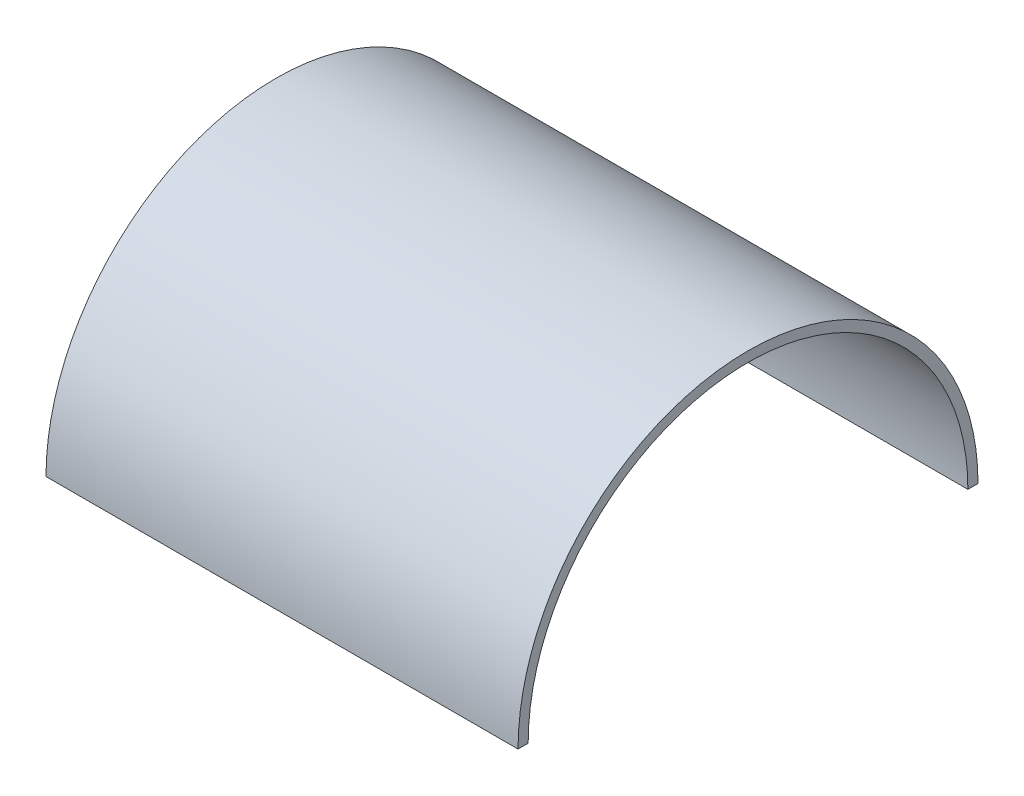
ISO-10303-21;
HEADER;
FILE_DESCRIPTION(('STEP AP214'),'2;1');
FILE_NAME('part.step','',(''),(''),'','','');
FILE_SCHEMA(('AUTOMOTIVE_DESIGN { 1 0 10303 214 1 1 1 1 }'));
ENDSEC;
DATA;
#1=APPLICATION_CONTEXT('core data for automotive mechanical design processes');
#2=APPLICATION_PROTOCOL_DEFINITION('international standard','automotive_design',2000,#1);
#3=PRODUCT_CONTEXT('',#1,'mechanical');
#4=PRODUCT('Part','Part','',(#3));
#5=PRODUCT_RELATED_PRODUCT_CATEGORY('part','',(#4));
#6=PRODUCT_DEFINITION_FORMATION('','',#4);
#7=PRODUCT_DEFINITION_CONTEXT('part definition',#1,'design');
#8=PRODUCT_DEFINITION('design','',#6,#7);
#9=PRODUCT_DEFINITION_SHAPE('','',#8);
#10=(LENGTH_UNIT() NAMED_UNIT(*) SI_UNIT(.MILLI.,.METRE.));
#11=(NAMED_UNIT(*) PLANE_ANGLE_UNIT() SI_UNIT($,.RADIAN.));
#12=(NAMED_UNIT(*) SI_UNIT($,.STERADIAN.) SOLID_ANGLE_UNIT());
#13=UNCERTAINTY_MEASURE_WITH_UNIT(LENGTH_MEASURE(1.E-05),#10,'distance_accuracy_value','');
#14=(GEOMETRIC_REPRESENTATION_CONTEXT(3) GLOBAL_UNCERTAINTY_ASSIGNED_CONTEXT((#13)) GLOBAL_UNIT_ASSIGNED_CONTEXT((#10,
#11,#12)) REPRESENTATION_CONTEXT('',''));
#15=CARTESIAN_POINT('',(0.,0.,0.));
#16=DIRECTION('',(0.,0.,1.));
#17=DIRECTION('',(1.,0.,0.));
#18=AXIS2_PLACEMENT_3D('',#15,#16,#17);
#19=CARTESIAN_POINT('',(-118.618,0.,-57.7898203895435));
#20=DIRECTION('',(1.,0.,0.));
#21=DIRECTION('',(0.,0.,-1.));
#22=AXIS2_PLACEMENT_3D('',#19,#20,#21);
#23=CYLINDRICAL_SURFACE('',#22,55.2498203895435);
#24=CARTESIAN_POINT('',(0.,0.,-57.7898203895435));
#25=DIRECTION('',(1.,0.,0.));
#26=DIRECTION('',(0.,0.,-1.));
#27=AXIS2_PLACEMENT_3D('',#24,#25,#26);
#28=CIRCLE('',#27,55.2498203895435);
#29=CARTESIAN_POINT('',(0.,0.,-2.54));
#30=VERTEX_POINT('',#29);
#31=CARTESIAN_POINT('',(0.,0.,-113.039640779087));
#32=VERTEX_POINT('',#31);
#33=EDGE_CURVE('E96',#30,#32,#28,.F.);
#34=ORIENTED_EDGE('',*,*,#33,.F.);
#35=DIRECTION('',(1.,0.,0.));
#36=VECTOR('',#35,1.);
#37=CARTESIAN_POINT('',(-118.618,0.,-2.54));
#38=LINE('',#37,#36);
#39=CARTESIAN_POINT('',(-118.618,0.,-2.54));
#40=VERTEX_POINT('',#39);
#41=EDGE_CURVE('E11',#40,#30,#38,.T.);
#42=ORIENTED_EDGE('',*,*,#41,.F.);
#43=CARTESIAN_POINT('',(-118.618,0.,-57.7898203895435));
#44=DIRECTION('',(1.,0.,0.));
#45=DIRECTION('',(0.,0.,-1.));
#46=AXIS2_PLACEMENT_3D('',#43,#44,#45);
#47=CIRCLE('',#46,55.2498203895435);
#48=CARTESIAN_POINT('',(-118.618,0.,-113.039640779087));
#49=VERTEX_POINT('',#48);
#50=EDGE_CURVE('E91',#40,#49,#47,.F.);
#51=ORIENTED_EDGE('',*,*,#50,.T.);
#52=DIRECTION('',(1.,0.,0.));
#53=VECTOR('',#52,1.);
#54=CARTESIAN_POINT('',(-118.618,0.,-113.039640779087));
#55=LINE('',#54,#53);
#56=EDGE_CURVE('E34',#49,#32,#55,.T.);
#57=ORIENTED_EDGE('',*,*,#56,.T.);
#58=EDGE_LOOP('',(#34,#42,#51,#57));
#59=FACE_BOUND('',#58,.T.);
#60=ADVANCED_FACE('F31',(#59),#23,.F.);
#61=CARTESIAN_POINT('',(-118.618,0.,-2.54));
#62=DIRECTION('',(0.,1.,0.));
#63=DIRECTION('',(0.,0.,1.));
#64=AXIS2_PLACEMENT_3D('',#61,#62,#63);
#65=PLANE('',#64);
#66=DIRECTION('',(0.,0.,1.));
#67=VECTOR('',#66,1.);
#68=CARTESIAN_POINT('',(0.,0.,-2.54));
#69=LINE('',#68,#67);
#70=CARTESIAN_POINT('',(0.,0.,0.));
#71=VERTEX_POINT('',#70);
#72=EDGE_CURVE('E64',#30,#71,#69,.T.);
#73=ORIENTED_EDGE('',*,*,#72,.T.);
#74=DIRECTION('',(1.,0.,0.));
#75=VECTOR('',#74,1.);
#76=CARTESIAN_POINT('',(-118.618,0.,0.));
#77=LINE('',#76,#75);
#78=CARTESIAN_POINT('',(-118.618,0.,0.));
#79=VERTEX_POINT('',#78);
#80=EDGE_CURVE('E40',#79,#71,#77,.T.);
#81=ORIENTED_EDGE('',*,*,#80,.F.);
#82=DIRECTION('',(0.,0.,1.));
#83=VECTOR('',#82,1.);
#84=CARTESIAN_POINT('',(-118.618,0.,-2.54));
#85=LINE('',#84,#83);
#86=EDGE_CURVE('E79',#40,#79,#85,.T.);
#87=ORIENTED_EDGE('',*,*,#86,.F.);
#88=ORIENTED_EDGE('',*,*,#41,.T.);
#89=EDGE_LOOP('',(#73,#81,#87,#88));
#90=FACE_BOUND('',#89,.T.);
#91=ADVANCED_FACE('F106',(#90),#65,.F.);
#92=CARTESIAN_POINT('',(-118.618,0.,-57.7898203895435));
#93=DIRECTION('',(1.,0.,0.));
#94=DIRECTION('',(0.,0.,-1.));
#95=AXIS2_PLACEMENT_3D('',#92,#93,#94);
#96=CYLINDRICAL_SURFACE('',#95,57.7898203895435);
#97=CARTESIAN_POINT('',(0.,0.,-57.7898203895435));
#98=DIRECTION('',(-1.,0.,0.));
#99=DIRECTION('',(0.,0.,1.));
#100=AXIS2_PLACEMENT_3D('',#97,#98,#99);
#101=CIRCLE('',#100,57.7898203895435);
#102=CARTESIAN_POINT('',(0.,0.,-115.579640779087));
#103=VERTEX_POINT('',#102);
#104=EDGE_CURVE('E86',#71,#103,#101,.T.);
#105=ORIENTED_EDGE('',*,*,#104,.T.);
#106=DIRECTION('',(1.,0.,0.));
#107=VECTOR('',#106,1.);
#108=CARTESIAN_POINT('',(-118.618,0.,-115.579640779087));
#109=LINE('',#108,#107);
#110=CARTESIAN_POINT('',(-118.618,0.,-115.579640779087));
#111=VERTEX_POINT('',#110);
#112=EDGE_CURVE('E83',#111,#103,#109,.T.);
#113=ORIENTED_EDGE('',*,*,#112,.F.);
#114=CARTESIAN_POINT('',(-118.618,0.,-57.7898203895435));
#115=DIRECTION('',(-1.,0.,0.));
#116=DIRECTION('',(0.,0.,1.));
#117=AXIS2_PLACEMENT_3D('',#114,#115,#116);
#118=CIRCLE('',#117,57.7898203895435);
#119=EDGE_CURVE('E76',#79,#111,#118,.T.);
#120=ORIENTED_EDGE('',*,*,#119,.F.);
#121=ORIENTED_EDGE('',*,*,#80,.T.);
#122=EDGE_LOOP('',(#105,#113,#120,#121));
#123=FACE_BOUND('',#122,.T.);
#124=ADVANCED_FACE('F84',(#123),#96,.T.);
#125=CARTESIAN_POINT('',(-118.618,0.,-115.579640779087));
#126=DIRECTION('',(0.,1.,0.));
#127=DIRECTION('',(0.,0.,1.));
#128=AXIS2_PLACEMENT_3D('',#125,#126,#127);
#129=PLANE('',#128);
#130=DIRECTION('',(0.,0.,1.));
#131=VECTOR('',#130,1.);
#132=CARTESIAN_POINT('',(0.,0.,-115.579640779087));
#133=LINE('',#132,#131);
#134=EDGE_CURVE('E99',#103,#32,#133,.T.);
#135=ORIENTED_EDGE('',*,*,#134,.T.);
#136=ORIENTED_EDGE('',*,*,#56,.F.);
#137=DIRECTION('',(0.,0.,1.));
#138=VECTOR('',#137,1.);
#139=CARTESIAN_POINT('',(-118.618,0.,-115.579640779087));
#140=LINE('',#139,#138);
#141=EDGE_CURVE('E73',#111,#49,#140,.T.);
#142=ORIENTED_EDGE('',*,*,#141,.F.);
#143=ORIENTED_EDGE('',*,*,#112,.T.);
#144=EDGE_LOOP('',(#135,#136,#142,#143));
#145=FACE_BOUND('',#144,.T.);
#146=ADVANCED_FACE('F90',(#145),#129,.F.);
#147=CARTESIAN_POINT('',(-118.618,0.,-57.7898203895435));
#148=DIRECTION('',(1.,0.,0.));
#149=DIRECTION('',(0.,0.,-1.));
#150=AXIS2_PLACEMENT_3D('',#147,#148,#149);
#151=PLANE('',#150);
#152=ORIENTED_EDGE('',*,*,#50,.F.);
#153=ORIENTED_EDGE('',*,*,#86,.T.);
#154=ORIENTED_EDGE('',*,*,#119,.T.);
#155=ORIENTED_EDGE('',*,*,#141,.T.);
#156=EDGE_LOOP('',(#152,#153,#154,#155));
#157=FACE_BOUND('',#156,.T.);
#158=ADVANCED_FACE('F78',(#157),#151,.F.);
#159=CARTESIAN_POINT('',(0.,0.,-57.7898203895435));
#160=DIRECTION('',(1.,0.,0.));
#161=DIRECTION('',(0.,0.,-1.));
#162=AXIS2_PLACEMENT_3D('',#159,#160,#161);
#163=PLANE('',#162);
#164=ORIENTED_EDGE('',*,*,#33,.T.);
#165=ORIENTED_EDGE('',*,*,#134,.F.);
#166=ORIENTED_EDGE('',*,*,#104,.F.);
#167=ORIENTED_EDGE('',*,*,#72,.F.);
#168=EDGE_LOOP('',(#164,#165,#166,#167));
#169=FACE_BOUND('',#168,.T.);
#170=ADVANCED_FACE('F104',(#169),#163,.T.);
#171=CLOSED_SHELL('',(#60,#91,#124,#146,#158,#170));
#172=MANIFOLD_SOLID_BREP('B2',#171);
#173=ADVANCED_BREP_SHAPE_REPRESENTATION('',(#18,#172),#14);
#174=SHAPE_DEFINITION_REPRESENTATION(#9,#173);
ENDSEC;
END-ISO-10303-21;
